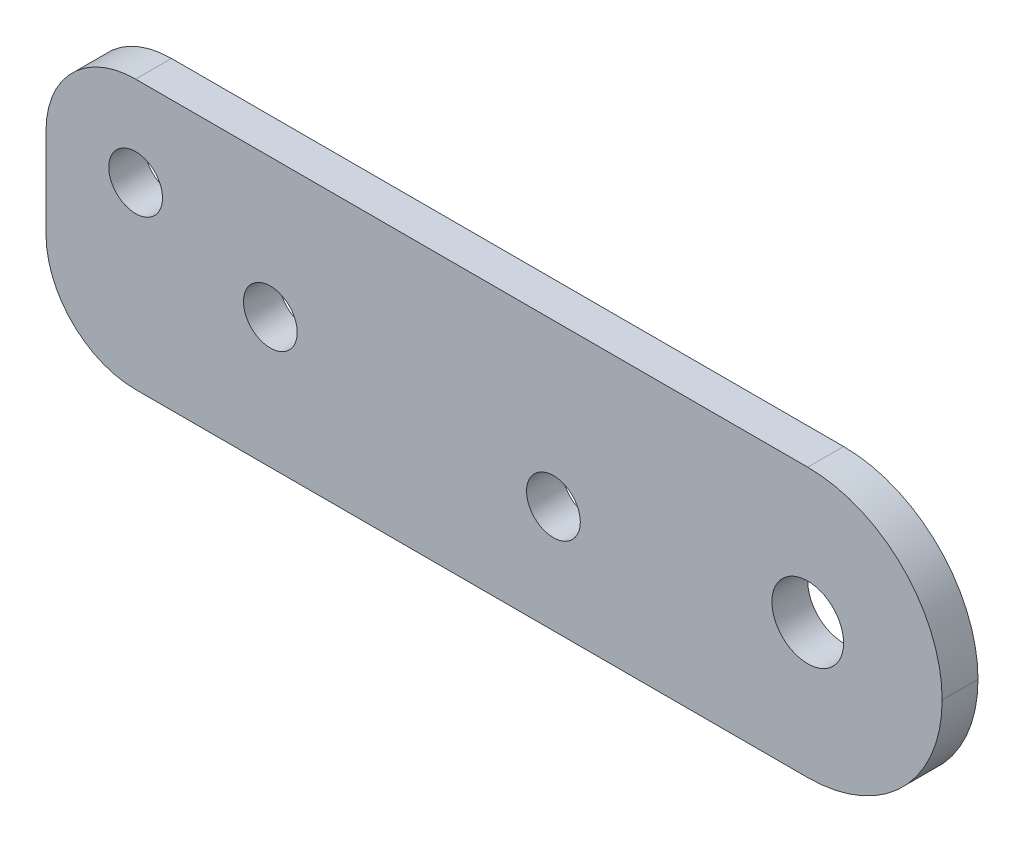
ISO-10303-21;
HEADER;
FILE_DESCRIPTION(('STEP AP214'),'2;1');
FILE_NAME('part.step','',(''),(''),'','','');
FILE_SCHEMA(('AUTOMOTIVE_DESIGN { 1 0 10303 214 1 1 1 1 }'));
ENDSEC;
DATA;
#1=APPLICATION_CONTEXT('core data for automotive mechanical design processes');
#2=APPLICATION_PROTOCOL_DEFINITION('international standard','automotive_design',2000,#1);
#3=PRODUCT_CONTEXT('',#1,'mechanical');
#4=PRODUCT('Part','Part','',(#3));
#5=PRODUCT_RELATED_PRODUCT_CATEGORY('part','',(#4));
#6=PRODUCT_DEFINITION_FORMATION('','',#4);
#7=PRODUCT_DEFINITION_CONTEXT('part definition',#1,'design');
#8=PRODUCT_DEFINITION('design','',#6,#7);
#9=PRODUCT_DEFINITION_SHAPE('','',#8);
#10=(LENGTH_UNIT() NAMED_UNIT(*) SI_UNIT(.MILLI.,.METRE.));
#11=(NAMED_UNIT(*) PLANE_ANGLE_UNIT() SI_UNIT($,.RADIAN.));
#12=(NAMED_UNIT(*) SI_UNIT($,.STERADIAN.) SOLID_ANGLE_UNIT());
#13=UNCERTAINTY_MEASURE_WITH_UNIT(LENGTH_MEASURE(1.E-05),#10,'distance_accuracy_value','');
#14=(GEOMETRIC_REPRESENTATION_CONTEXT(3) GLOBAL_UNCERTAINTY_ASSIGNED_CONTEXT((#13)) GLOBAL_UNIT_ASSIGNED_CONTEXT((#10,
#11,#12)) REPRESENTATION_CONTEXT('',''));
#15=CARTESIAN_POINT('',(0.,0.,0.));
#16=DIRECTION('',(0.,0.,1.));
#17=DIRECTION('',(1.,0.,0.));
#18=AXIS2_PLACEMENT_3D('',#15,#16,#17);
#19=CARTESIAN_POINT('',(-25.,7.5,2.));
#20=DIRECTION('',(0.,-1.,0.));
#21=DIRECTION('',(0.,0.,-1.));
#22=AXIS2_PLACEMENT_3D('',#19,#20,#21);
#23=PLANE('',#22);
#24=DIRECTION('',(-1.,0.,0.));
#25=VECTOR('',#24,1.);
#26=CARTESIAN_POINT('',(-25.,7.5,2.));
#27=LINE('',#26,#25);
#28=CARTESIAN_POINT('',(17.5,7.5,2.));
#29=VERTEX_POINT('',#28);
#30=CARTESIAN_POINT('',(-20.,7.5,2.));
#31=VERTEX_POINT('',#30);
#32=EDGE_CURVE('E116',#29,#31,#27,.T.);
#33=ORIENTED_EDGE('',*,*,#32,.F.);
#34=DIRECTION('',(0.,0.,-1.));
#35=VECTOR('',#34,1.);
#36=CARTESIAN_POINT('',(17.5,7.5,2.));
#37=LINE('',#36,#35);
#38=CARTESIAN_POINT('',(17.5,7.5,0.));
#39=VERTEX_POINT('',#38);
#40=EDGE_CURVE('E11',#29,#39,#37,.T.);
#41=ORIENTED_EDGE('',*,*,#40,.T.);
#42=DIRECTION('',(-1.,0.,0.));
#43=VECTOR('',#42,1.);
#44=CARTESIAN_POINT('',(-25.,7.5,0.));
#45=LINE('',#44,#43);
#46=CARTESIAN_POINT('',(-20.,7.5,0.));
#47=VERTEX_POINT('',#46);
#48=EDGE_CURVE('E121',#39,#47,#45,.T.);
#49=ORIENTED_EDGE('',*,*,#48,.T.);
#50=DIRECTION('',(0.,0.,-1.));
#51=VECTOR('',#50,1.);
#52=CARTESIAN_POINT('',(-20.,7.5,2.));
#53=LINE('',#52,#51);
#54=EDGE_CURVE('E134',#47,#31,#53,.F.);
#55=ORIENTED_EDGE('',*,*,#54,.T.);
#56=EDGE_LOOP('',(#33,#41,#49,#55));
#57=FACE_BOUND('',#56,.T.);
#58=ADVANCED_FACE('F34',(#57),#23,.F.);
#59=CARTESIAN_POINT('',(-25.,-7.5,2.));
#60=DIRECTION('',(1.,0.,0.));
#61=DIRECTION('',(0.,0.,-1.));
#62=AXIS2_PLACEMENT_3D('',#59,#60,#61);
#63=PLANE('',#62);
#64=DIRECTION('',(0.,-1.,0.));
#65=VECTOR('',#64,1.);
#66=CARTESIAN_POINT('',(-25.,-7.5,0.));
#67=LINE('',#66,#65);
#68=CARTESIAN_POINT('',(-25.,2.5,0.));
#69=VERTEX_POINT('',#68);
#70=CARTESIAN_POINT('',(-25.,-2.5,0.));
#71=VERTEX_POINT('',#70);
#72=EDGE_CURVE('E117',#69,#71,#67,.T.);
#73=ORIENTED_EDGE('',*,*,#72,.T.);
#74=DIRECTION('',(0.,0.,-1.));
#75=VECTOR('',#74,1.);
#76=CARTESIAN_POINT('',(-25.,-2.5,2.));
#77=LINE('',#76,#75);
#78=CARTESIAN_POINT('',(-25.,-2.5,2.));
#79=VERTEX_POINT('',#78);
#80=EDGE_CURVE('E96',#71,#79,#77,.F.);
#81=ORIENTED_EDGE('',*,*,#80,.T.);
#82=DIRECTION('',(0.,-1.,0.));
#83=VECTOR('',#82,1.);
#84=CARTESIAN_POINT('',(-25.,-7.5,2.));
#85=LINE('',#84,#83);
#86=CARTESIAN_POINT('',(-25.,2.5,2.));
#87=VERTEX_POINT('',#86);
#88=EDGE_CURVE('E119',#87,#79,#85,.T.);
#89=ORIENTED_EDGE('',*,*,#88,.F.);
#90=DIRECTION('',(0.,0.,-1.));
#91=VECTOR('',#90,1.);
#92=CARTESIAN_POINT('',(-25.,2.5,2.));
#93=LINE('',#92,#91);
#94=EDGE_CURVE('E101',#87,#69,#93,.T.);
#95=ORIENTED_EDGE('',*,*,#94,.T.);
#96=EDGE_LOOP('',(#73,#81,#89,#95));
#97=FACE_BOUND('',#96,.T.);
#98=ADVANCED_FACE('F167',(#97),#63,.F.);
#99=CARTESIAN_POINT('',(-25.,-7.5,2.));
#100=DIRECTION('',(0.,1.,0.));
#101=DIRECTION('',(0.,0.,1.));
#102=AXIS2_PLACEMENT_3D('',#99,#100,#101);
#103=PLANE('',#102);
#104=DIRECTION('',(1.,0.,0.));
#105=VECTOR('',#104,1.);
#106=CARTESIAN_POINT('',(-25.,-7.5,0.));
#107=LINE('',#106,#105);
#108=CARTESIAN_POINT('',(-20.,-7.5,0.));
#109=VERTEX_POINT('',#108);
#110=CARTESIAN_POINT('',(17.5,-7.5,0.));
#111=VERTEX_POINT('',#110);
#112=EDGE_CURVE('E109',#109,#111,#107,.T.);
#113=ORIENTED_EDGE('',*,*,#112,.T.);
#114=DIRECTION('',(0.,0.,-1.));
#115=VECTOR('',#114,1.);
#116=CARTESIAN_POINT('',(17.5,-7.5,2.));
#117=LINE('',#116,#115);
#118=CARTESIAN_POINT('',(17.5,-7.5,2.));
#119=VERTEX_POINT('',#118);
#120=EDGE_CURVE('E140',#111,#119,#117,.F.);
#121=ORIENTED_EDGE('',*,*,#120,.T.);
#122=DIRECTION('',(1.,0.,0.));
#123=VECTOR('',#122,1.);
#124=CARTESIAN_POINT('',(-25.,-7.5,2.));
#125=LINE('',#124,#123);
#126=CARTESIAN_POINT('',(-20.,-7.5,2.));
#127=VERTEX_POINT('',#126);
#128=EDGE_CURVE('E111',#127,#119,#125,.T.);
#129=ORIENTED_EDGE('',*,*,#128,.F.);
#130=DIRECTION('',(0.,0.,-1.));
#131=VECTOR('',#130,1.);
#132=CARTESIAN_POINT('',(-20.,-7.5,2.));
#133=LINE('',#132,#131);
#134=EDGE_CURVE('E95',#127,#109,#133,.T.);
#135=ORIENTED_EDGE('',*,*,#134,.T.);
#136=EDGE_LOOP('',(#113,#121,#129,#135));
#137=FACE_BOUND('',#136,.T.);
#138=ADVANCED_FACE('F107',(#137),#103,.F.);
#139=CARTESIAN_POINT('',(0.,0.,2.));
#140=DIRECTION('',(0.,0.,-1.));
#141=DIRECTION('',(-1.,0.,0.));
#142=AXIS2_PLACEMENT_3D('',#139,#140,#141);
#143=PLANE('',#142);
#144=CARTESIAN_POINT('',(3.31059122452725,-1.49999999999998,2.));
#145=DIRECTION('',(0.,0.,1.));
#146=DIRECTION('',(1.,0.,0.));
#147=AXIS2_PLACEMENT_3D('',#144,#145,#146);
#148=CIRCLE('',#147,1.5);
#149=CARTESIAN_POINT('',(4.81059122452725,-1.49999999999998,2.));
#150=VERTEX_POINT('',#149);
#151=EDGE_CURVE('E294',#150,#150,#148,.T.);
#152=ORIENTED_EDGE('',*,*,#151,.F.);
#153=EDGE_LOOP('',(#152));
#154=FACE_BOUND('',#153,.T.);
#155=CARTESIAN_POINT('',(-12.4824590337127,-0.236161146605326,2.));
#156=DIRECTION('',(0.,0.,1.));
#157=DIRECTION('',(1.,0.,0.));
#158=AXIS2_PLACEMENT_3D('',#155,#156,#157);
#159=CIRCLE('',#158,1.5);
#160=CARTESIAN_POINT('',(-10.9824590337127,-0.236161146605326,2.));
#161=VERTEX_POINT('',#160);
#162=EDGE_CURVE('E299',#161,#161,#159,.T.);
#163=ORIENTED_EDGE('',*,*,#162,.F.);
#164=EDGE_LOOP('',(#163));
#165=FACE_BOUND('',#164,.T.);
#166=CARTESIAN_POINT('',(17.5,0.,2.));
#167=DIRECTION('',(0.,0.,1.));
#168=DIRECTION('',(1.,0.,0.));
#169=AXIS2_PLACEMENT_3D('',#166,#167,#168);
#170=CIRCLE('',#169,2.);
#171=CARTESIAN_POINT('',(19.5,0.,2.));
#172=VERTEX_POINT('',#171);
#173=EDGE_CURVE('E157',#172,#172,#170,.T.);
#174=ORIENTED_EDGE('',*,*,#173,.F.);
#175=EDGE_LOOP('',(#174));
#176=FACE_BOUND('',#175,.T.);
#177=CARTESIAN_POINT('',(-20.,2.5,2.));
#178=DIRECTION('',(0.,0.,1.));
#179=DIRECTION('',(1.,0.,0.));
#180=AXIS2_PLACEMENT_3D('',#177,#178,#179);
#181=CIRCLE('',#180,1.5);
#182=CARTESIAN_POINT('',(-18.5,2.5,2.));
#183=VERTEX_POINT('',#182);
#184=EDGE_CURVE('E149',#183,#183,#181,.T.);
#185=ORIENTED_EDGE('',*,*,#184,.F.);
#186=EDGE_LOOP('',(#185));
#187=FACE_BOUND('',#186,.T.);
#188=ORIENTED_EDGE('',*,*,#128,.T.);
#189=CARTESIAN_POINT('',(17.5,0.,2.));
#190=DIRECTION('',(0.,0.,-1.));
#191=DIRECTION('',(-1.,0.,0.));
#192=AXIS2_PLACEMENT_3D('',#189,#190,#191);
#193=CIRCLE('',#192,7.5);
#194=CARTESIAN_POINT('',(25.,0.,2.));
#195=VERTEX_POINT('',#194);
#196=EDGE_CURVE('E43',#119,#195,#193,.F.);
#197=ORIENTED_EDGE('',*,*,#196,.T.);
#198=CARTESIAN_POINT('',(17.5,0.,2.));
#199=DIRECTION('',(0.,0.,-1.));
#200=DIRECTION('',(-1.,0.,0.));
#201=AXIS2_PLACEMENT_3D('',#198,#199,#200);
#202=CIRCLE('',#201,7.5);
#203=EDGE_CURVE('E51',#195,#29,#202,.F.);
#204=ORIENTED_EDGE('',*,*,#203,.T.);
#205=ORIENTED_EDGE('',*,*,#32,.T.);
#206=CARTESIAN_POINT('',(-20.,2.5,2.));
#207=DIRECTION('',(0.,0.,-1.));
#208=DIRECTION('',(-1.,0.,0.));
#209=AXIS2_PLACEMENT_3D('',#206,#207,#208);
#210=CIRCLE('',#209,5.);
#211=EDGE_CURVE('E130',#31,#87,#210,.F.);
#212=ORIENTED_EDGE('',*,*,#211,.T.);
#213=ORIENTED_EDGE('',*,*,#88,.T.);
#214=CARTESIAN_POINT('',(-20.,-2.5,2.));
#215=DIRECTION('',(0.,0.,-1.));
#216=DIRECTION('',(-1.,0.,0.));
#217=AXIS2_PLACEMENT_3D('',#214,#215,#216);
#218=CIRCLE('',#217,5.);
#219=EDGE_CURVE('E132',#79,#127,#218,.F.);
#220=ORIENTED_EDGE('',*,*,#219,.T.);
#221=EDGE_LOOP('',(#188,#197,#204,#205,#212,#213,#220));
#222=FACE_BOUND('',#221,.T.);
#223=ADVANCED_FACE('F162',(#154,#165,#176,#187,#222),#143,.F.);
#224=CARTESIAN_POINT('',(0.,0.,0.));
#225=DIRECTION('',(0.,0.,-1.));
#226=DIRECTION('',(-1.,0.,0.));
#227=AXIS2_PLACEMENT_3D('',#224,#225,#226);
#228=PLANE('',#227);
#229=CARTESIAN_POINT('',(3.31059122452725,-1.49999999999998,0.));
#230=DIRECTION('',(0.,0.,-1.));
#231=DIRECTION('',(-1.,0.,0.));
#232=AXIS2_PLACEMENT_3D('',#229,#230,#231);
#233=CIRCLE('',#232,1.5);
#234=CARTESIAN_POINT('',(1.81059122452725,-1.49999999999998,0.));
#235=VERTEX_POINT('',#234);
#236=EDGE_CURVE('E38',#235,#235,#233,.T.);
#237=ORIENTED_EDGE('',*,*,#236,.F.);
#238=EDGE_LOOP('',(#237));
#239=FACE_BOUND('',#238,.T.);
#240=CARTESIAN_POINT('',(-12.4824590337127,-0.236161146605326,0.));
#241=DIRECTION('',(0.,0.,1.));
#242=DIRECTION('',(1.,0.,0.));
#243=AXIS2_PLACEMENT_3D('',#240,#241,#242);
#244=CIRCLE('',#243,1.5);
#245=CARTESIAN_POINT('',(-10.9824590337127,-0.236161146605326,0.));
#246=VERTEX_POINT('',#245);
#247=EDGE_CURVE('E154',#246,#246,#244,.T.);
#248=ORIENTED_EDGE('',*,*,#247,.T.);
#249=EDGE_LOOP('',(#248));
#250=FACE_BOUND('',#249,.T.);
#251=CARTESIAN_POINT('',(17.5,0.,0.));
#252=DIRECTION('',(0.,0.,1.));
#253=DIRECTION('',(1.,0.,0.));
#254=AXIS2_PLACEMENT_3D('',#251,#252,#253);
#255=CIRCLE('',#254,2.);
#256=CARTESIAN_POINT('',(19.5,0.,0.));
#257=VERTEX_POINT('',#256);
#258=EDGE_CURVE('E301',#257,#257,#255,.T.);
#259=ORIENTED_EDGE('',*,*,#258,.T.);
#260=EDGE_LOOP('',(#259));
#261=FACE_BOUND('',#260,.T.);
#262=CARTESIAN_POINT('',(-20.,2.5,0.));
#263=DIRECTION('',(0.,0.,1.));
#264=DIRECTION('',(1.,0.,0.));
#265=AXIS2_PLACEMENT_3D('',#262,#263,#264);
#266=CIRCLE('',#265,1.5);
#267=CARTESIAN_POINT('',(-18.5,2.5,0.));
#268=VERTEX_POINT('',#267);
#269=EDGE_CURVE('E145',#268,#268,#266,.T.);
#270=ORIENTED_EDGE('',*,*,#269,.T.);
#271=EDGE_LOOP('',(#270));
#272=FACE_BOUND('',#271,.T.);
#273=CARTESIAN_POINT('',(17.5,0.,0.));
#274=DIRECTION('',(0.,0.,-1.));
#275=DIRECTION('',(-1.,0.,0.));
#276=AXIS2_PLACEMENT_3D('',#273,#274,#275);
#277=CIRCLE('',#276,7.5);
#278=CARTESIAN_POINT('',(25.,0.,0.));
#279=VERTEX_POINT('',#278);
#280=EDGE_CURVE('E137',#39,#279,#277,.T.);
#281=ORIENTED_EDGE('',*,*,#280,.T.);
#282=CARTESIAN_POINT('',(17.5,0.,0.));
#283=DIRECTION('',(0.,0.,-1.));
#284=DIRECTION('',(-1.,0.,0.));
#285=AXIS2_PLACEMENT_3D('',#282,#283,#284);
#286=CIRCLE('',#285,7.5);
#287=EDGE_CURVE('E115',#279,#111,#286,.T.);
#288=ORIENTED_EDGE('',*,*,#287,.T.);
#289=ORIENTED_EDGE('',*,*,#112,.F.);
#290=CARTESIAN_POINT('',(-20.,-2.5,0.));
#291=DIRECTION('',(0.,0.,-1.));
#292=DIRECTION('',(-1.,0.,0.));
#293=AXIS2_PLACEMENT_3D('',#290,#291,#292);
#294=CIRCLE('',#293,5.);
#295=EDGE_CURVE('E91',#109,#71,#294,.T.);
#296=ORIENTED_EDGE('',*,*,#295,.T.);
#297=ORIENTED_EDGE('',*,*,#72,.F.);
#298=CARTESIAN_POINT('',(-20.,2.5,0.));
#299=DIRECTION('',(0.,0.,-1.));
#300=DIRECTION('',(-1.,0.,0.));
#301=AXIS2_PLACEMENT_3D('',#298,#299,#300);
#302=CIRCLE('',#301,5.);
#303=EDGE_CURVE('E102',#69,#47,#302,.T.);
#304=ORIENTED_EDGE('',*,*,#303,.T.);
#305=ORIENTED_EDGE('',*,*,#48,.F.);
#306=EDGE_LOOP('',(#281,#288,#289,#296,#297,#304,#305));
#307=FACE_BOUND('',#306,.T.);
#308=ADVANCED_FACE('F113',(#239,#250,#261,#272,#307),#228,.T.);
#309=CARTESIAN_POINT('',(-20.,-2.5,2.));
#310=DIRECTION('',(0.,0.,-1.));
#311=DIRECTION('',(-1.,0.,0.));
#312=AXIS2_PLACEMENT_3D('',#309,#310,#311);
#313=CYLINDRICAL_SURFACE('',#312,5.);
#314=ORIENTED_EDGE('',*,*,#219,.F.);
#315=ORIENTED_EDGE('',*,*,#80,.F.);
#316=ORIENTED_EDGE('',*,*,#295,.F.);
#317=ORIENTED_EDGE('',*,*,#134,.F.);
#318=EDGE_LOOP('',(#314,#315,#316,#317));
#319=FACE_BOUND('',#318,.T.);
#320=ADVANCED_FACE('F94',(#319),#313,.T.);
#321=CARTESIAN_POINT('',(-20.,2.5,2.));
#322=DIRECTION('',(0.,0.,-1.));
#323=DIRECTION('',(-1.,0.,0.));
#324=AXIS2_PLACEMENT_3D('',#321,#322,#323);
#325=CYLINDRICAL_SURFACE('',#324,5.);
#326=ORIENTED_EDGE('',*,*,#211,.F.);
#327=ORIENTED_EDGE('',*,*,#54,.F.);
#328=ORIENTED_EDGE('',*,*,#303,.F.);
#329=ORIENTED_EDGE('',*,*,#94,.F.);
#330=EDGE_LOOP('',(#326,#327,#328,#329));
#331=FACE_BOUND('',#330,.T.);
#332=ADVANCED_FACE('F169',(#331),#325,.T.);
#333=CARTESIAN_POINT('',(17.5,0.,2.));
#334=DIRECTION('',(0.,0.,-1.));
#335=DIRECTION('',(-1.,0.,0.));
#336=AXIS2_PLACEMENT_3D('',#333,#334,#335);
#337=CYLINDRICAL_SURFACE('',#336,7.5);
#338=ORIENTED_EDGE('',*,*,#40,.F.);
#339=ORIENTED_EDGE('',*,*,#203,.F.);
#340=DIRECTION('',(0.,0.,-1.));
#341=VECTOR('',#340,1.);
#342=CARTESIAN_POINT('',(25.,0.,2.));
#343=LINE('',#342,#341);
#344=EDGE_CURVE('E143',#279,#195,#343,.F.);
#345=ORIENTED_EDGE('',*,*,#344,.F.);
#346=ORIENTED_EDGE('',*,*,#280,.F.);
#347=EDGE_LOOP('',(#338,#339,#345,#346));
#348=FACE_BOUND('',#347,.T.);
#349=ADVANCED_FACE('F36',(#348),#337,.T.);
#350=CARTESIAN_POINT('',(17.5,0.,2.));
#351=DIRECTION('',(0.,0.,-1.));
#352=DIRECTION('',(-1.,0.,0.));
#353=AXIS2_PLACEMENT_3D('',#350,#351,#352);
#354=CYLINDRICAL_SURFACE('',#353,7.5);
#355=ORIENTED_EDGE('',*,*,#196,.F.);
#356=ORIENTED_EDGE('',*,*,#120,.F.);
#357=ORIENTED_EDGE('',*,*,#287,.F.);
#358=ORIENTED_EDGE('',*,*,#344,.T.);
#359=EDGE_LOOP('',(#355,#356,#357,#358));
#360=FACE_BOUND('',#359,.T.);
#361=ADVANCED_FACE('F176',(#360),#354,.T.);
#362=CARTESIAN_POINT('',(-20.,2.5,0.));
#363=DIRECTION('',(0.,0.,1.));
#364=DIRECTION('',(1.,0.,0.));
#365=AXIS2_PLACEMENT_3D('',#362,#363,#364);
#366=CYLINDRICAL_SURFACE('',#365,1.5);
#367=ORIENTED_EDGE('',*,*,#269,.F.);
#368=EDGE_LOOP('',(#367));
#369=FACE_BOUND('',#368,.T.);
#370=ORIENTED_EDGE('',*,*,#184,.T.);
#371=EDGE_LOOP('',(#370));
#372=FACE_BOUND('',#371,.T.);
#373=ADVANCED_FACE('F178',(#369,#372),#366,.F.);
#374=CARTESIAN_POINT('',(17.5,0.,0.));
#375=DIRECTION('',(0.,0.,1.));
#376=DIRECTION('',(1.,0.,0.));
#377=AXIS2_PLACEMENT_3D('',#374,#375,#376);
#378=CYLINDRICAL_SURFACE('',#377,2.);
#379=ORIENTED_EDGE('',*,*,#258,.F.);
#380=EDGE_LOOP('',(#379));
#381=FACE_BOUND('',#380,.T.);
#382=ORIENTED_EDGE('',*,*,#173,.T.);
#383=EDGE_LOOP('',(#382));
#384=FACE_BOUND('',#383,.T.);
#385=ADVANCED_FACE('F183',(#381,#384),#378,.F.);
#386=CARTESIAN_POINT('',(-12.4824590337127,-0.236161146605326,0.));
#387=DIRECTION('',(0.,0.,1.));
#388=DIRECTION('',(1.,0.,0.));
#389=AXIS2_PLACEMENT_3D('',#386,#387,#388);
#390=CYLINDRICAL_SURFACE('',#389,1.5);
#391=ORIENTED_EDGE('',*,*,#247,.F.);
#392=EDGE_LOOP('',(#391));
#393=FACE_BOUND('',#392,.T.);
#394=ORIENTED_EDGE('',*,*,#162,.T.);
#395=EDGE_LOOP('',(#394));
#396=FACE_BOUND('',#395,.T.);
#397=ADVANCED_FACE('F229',(#393,#396),#390,.F.);
#398=CARTESIAN_POINT('',(3.31059122452725,-1.49999999999998,-8.));
#399=DIRECTION('',(0.,0.,1.));
#400=DIRECTION('',(1.,0.,0.));
#401=AXIS2_PLACEMENT_3D('',#398,#399,#400);
#402=CYLINDRICAL_SURFACE('',#401,1.5);
#403=ORIENTED_EDGE('',*,*,#236,.T.);
#404=EDGE_LOOP('',(#403));
#405=FACE_BOUND('',#404,.T.);
#406=ORIENTED_EDGE('',*,*,#151,.T.);
#407=EDGE_LOOP('',(#406));
#408=FACE_BOUND('',#407,.T.);
#409=ADVANCED_FACE('F239',(#405,#408),#402,.F.);
#410=CLOSED_SHELL('',(#58,#98,#138,#223,#308,#320,#332,#349,#361,#373,#385,#397,#409));
#411=MANIFOLD_SOLID_BREP('B2',#410);
#412=ADVANCED_BREP_SHAPE_REPRESENTATION('',(#18,#411),#14);
#413=SHAPE_DEFINITION_REPRESENTATION(#9,#412);
ENDSEC;
END-ISO-10303-21;
